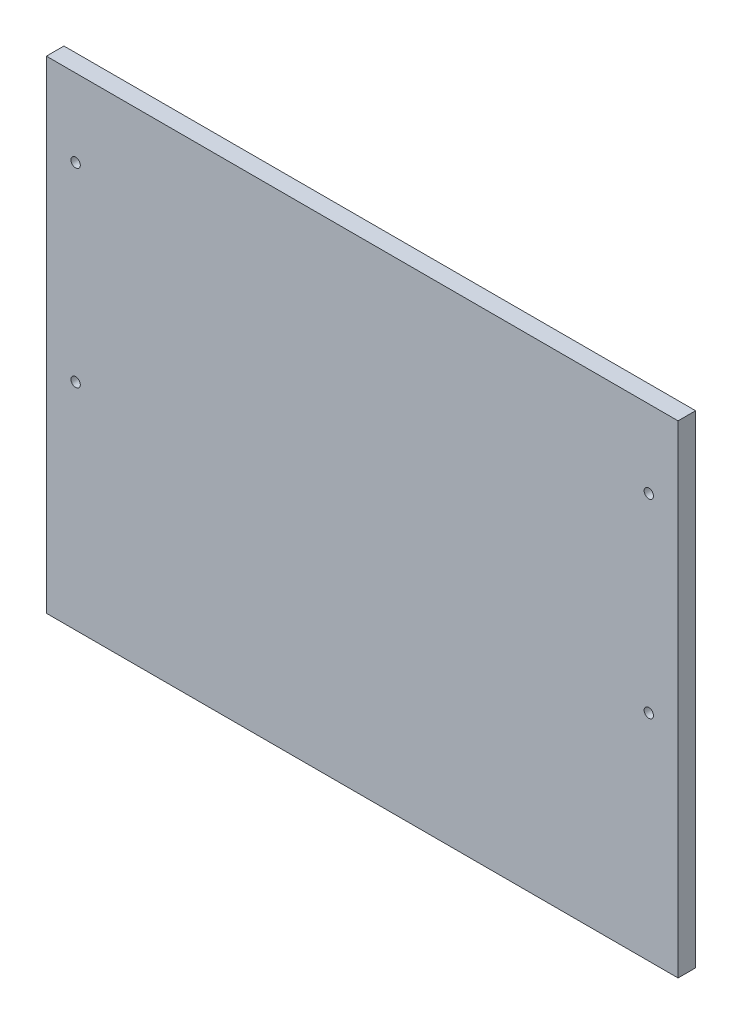
ISO-10303-21;
HEADER;
FILE_DESCRIPTION(('STEP AP214'),'2;1');
FILE_NAME('part.step','',(''),(''),'','','');
FILE_SCHEMA(('AUTOMOTIVE_DESIGN { 1 0 10303 214 1 1 1 1 }'));
ENDSEC;
DATA;
#1=APPLICATION_CONTEXT('core data for automotive mechanical design processes');
#2=APPLICATION_PROTOCOL_DEFINITION('international standard','automotive_design',2000,#1);
#3=PRODUCT_CONTEXT('',#1,'mechanical');
#4=PRODUCT('Part','Part','',(#3));
#5=PRODUCT_RELATED_PRODUCT_CATEGORY('part','',(#4));
#6=PRODUCT_DEFINITION_FORMATION('','',#4);
#7=PRODUCT_DEFINITION_CONTEXT('part definition',#1,'design');
#8=PRODUCT_DEFINITION('design','',#6,#7);
#9=PRODUCT_DEFINITION_SHAPE('','',#8);
#10=(LENGTH_UNIT() NAMED_UNIT(*) SI_UNIT(.MILLI.,.METRE.));
#11=(NAMED_UNIT(*) PLANE_ANGLE_UNIT() SI_UNIT($,.RADIAN.));
#12=(NAMED_UNIT(*) SI_UNIT($,.STERADIAN.) SOLID_ANGLE_UNIT());
#13=UNCERTAINTY_MEASURE_WITH_UNIT(LENGTH_MEASURE(1.E-05),#10,'distance_accuracy_value','');
#14=(GEOMETRIC_REPRESENTATION_CONTEXT(3) GLOBAL_UNCERTAINTY_ASSIGNED_CONTEXT((#13)) GLOBAL_UNIT_ASSIGNED_CONTEXT((#10,
#11,#12)) REPRESENTATION_CONTEXT('',''));
#15=CARTESIAN_POINT('',(0.,0.,0.));
#16=DIRECTION('',(0.,0.,1.));
#17=DIRECTION('',(1.,0.,0.));
#18=AXIS2_PLACEMENT_3D('',#15,#16,#17);
#19=CARTESIAN_POINT('',(0.,0.,12.));
#20=DIRECTION('',(0.,0.,1.));
#21=DIRECTION('',(1.,0.,0.));
#22=AXIS2_PLACEMENT_3D('',#19,#20,#21);
#23=PLANE('',#22);
#24=CARTESIAN_POINT('',(20.,-88.,12.));
#25=DIRECTION('',(0.,0.,1.));
#26=DIRECTION('',(1.,0.,0.));
#27=AXIS2_PLACEMENT_3D('',#24,#25,#26);
#28=CIRCLE('',#27,3.2);
#29=CARTESIAN_POINT('',(23.2,-88.,12.));
#30=VERTEX_POINT('',#29);
#31=EDGE_CURVE('E129',#30,#30,#28,.T.);
#32=ORIENTED_EDGE('',*,*,#31,.F.);
#33=EDGE_LOOP('',(#32));
#34=FACE_BOUND('',#33,.T.);
#35=CARTESIAN_POINT('',(20.,42.,12.));
#36=DIRECTION('',(0.,0.,1.));
#37=DIRECTION('',(1.,0.,0.));
#38=AXIS2_PLACEMENT_3D('',#35,#36,#37);
#39=CIRCLE('',#38,3.2);
#40=CARTESIAN_POINT('',(23.2,42.,12.));
#41=VERTEX_POINT('',#40);
#42=EDGE_CURVE('E108',#41,#41,#39,.T.);
#43=ORIENTED_EDGE('',*,*,#42,.F.);
#44=EDGE_LOOP('',(#43));
#45=FACE_BOUND('',#44,.T.);
#46=DIRECTION('',(0.,-1.,0.));
#47=VECTOR('',#46,1.);
#48=CARTESIAN_POINT('',(0.,95.,12.));
#49=LINE('',#48,#47);
#50=CARTESIAN_POINT('',(0.,95.,12.));
#51=VERTEX_POINT('',#50);
#52=CARTESIAN_POINT('',(0.,-235.,12.));
#53=VERTEX_POINT('',#52);
#54=EDGE_CURVE('E93',#51,#53,#49,.T.);
#55=ORIENTED_EDGE('',*,*,#54,.T.);
#56=DIRECTION('',(1.,0.,0.));
#57=VECTOR('',#56,1.);
#58=CARTESIAN_POINT('',(0.,-235.,12.));
#59=LINE('',#58,#57);
#60=CARTESIAN_POINT('',(432.,-235.,12.));
#61=VERTEX_POINT('',#60);
#62=EDGE_CURVE('E88',#53,#61,#59,.T.);
#63=ORIENTED_EDGE('',*,*,#62,.T.);
#64=DIRECTION('',(0.,1.,0.));
#65=VECTOR('',#64,1.);
#66=CARTESIAN_POINT('',(432.,-235.,12.));
#67=LINE('',#66,#65);
#68=CARTESIAN_POINT('',(432.,95.,12.));
#69=VERTEX_POINT('',#68);
#70=EDGE_CURVE('E91',#61,#69,#67,.T.);
#71=ORIENTED_EDGE('',*,*,#70,.T.);
#72=DIRECTION('',(-1.,0.,0.));
#73=VECTOR('',#72,1.);
#74=CARTESIAN_POINT('',(432.,95.,12.));
#75=LINE('',#74,#73);
#76=EDGE_CURVE('E58',#69,#51,#75,.T.);
#77=ORIENTED_EDGE('',*,*,#76,.T.);
#78=EDGE_LOOP('',(#55,#63,#71,#77));
#79=FACE_BOUND('',#78,.T.);
#80=CARTESIAN_POINT('',(412.,42.,12.));
#81=DIRECTION('',(0.,0.,1.));
#82=DIRECTION('',(1.,0.,0.));
#83=AXIS2_PLACEMENT_3D('',#80,#81,#82);
#84=CIRCLE('',#83,3.19999999999998);
#85=CARTESIAN_POINT('',(415.2,42.,12.));
#86=VERTEX_POINT('',#85);
#87=EDGE_CURVE('E123',#86,#86,#84,.T.);
#88=ORIENTED_EDGE('',*,*,#87,.F.);
#89=EDGE_LOOP('',(#88));
#90=FACE_BOUND('',#89,.T.);
#91=CARTESIAN_POINT('',(412.,-88.,12.));
#92=DIRECTION('',(0.,0.,1.));
#93=DIRECTION('',(1.,0.,0.));
#94=AXIS2_PLACEMENT_3D('',#91,#92,#93);
#95=CIRCLE('',#94,3.19999999999998);
#96=CARTESIAN_POINT('',(415.2,-88.,12.));
#97=VERTEX_POINT('',#96);
#98=EDGE_CURVE('E135',#97,#97,#95,.T.);
#99=ORIENTED_EDGE('',*,*,#98,.F.);
#100=EDGE_LOOP('',(#99));
#101=FACE_BOUND('',#100,.T.);
#102=ADVANCED_FACE('F41',(#34,#45,#79,#90,#101),#23,.T.);
#103=CARTESIAN_POINT('',(0.,0.,0.));
#104=DIRECTION('',(0.,0.,1.));
#105=DIRECTION('',(1.,0.,0.));
#106=AXIS2_PLACEMENT_3D('',#103,#104,#105);
#107=PLANE('',#106);
#108=DIRECTION('',(0.,-1.,0.));
#109=VECTOR('',#108,1.);
#110=CARTESIAN_POINT('',(0.,95.,0.));
#111=LINE('',#110,#109);
#112=CARTESIAN_POINT('',(0.,95.,0.));
#113=VERTEX_POINT('',#112);
#114=CARTESIAN_POINT('',(0.,-235.,0.));
#115=VERTEX_POINT('',#114);
#116=EDGE_CURVE('E105',#113,#115,#111,.T.);
#117=ORIENTED_EDGE('',*,*,#116,.F.);
#118=DIRECTION('',(-1.,0.,0.));
#119=VECTOR('',#118,1.);
#120=CARTESIAN_POINT('',(432.,95.,0.));
#121=LINE('',#120,#119);
#122=CARTESIAN_POINT('',(432.,95.,0.));
#123=VERTEX_POINT('',#122);
#124=EDGE_CURVE('E81',#123,#113,#121,.T.);
#125=ORIENTED_EDGE('',*,*,#124,.F.);
#126=DIRECTION('',(0.,1.,0.));
#127=VECTOR('',#126,1.);
#128=CARTESIAN_POINT('',(432.,-235.,0.));
#129=LINE('',#128,#127);
#130=CARTESIAN_POINT('',(432.,-235.,0.));
#131=VERTEX_POINT('',#130);
#132=EDGE_CURVE('E75',#131,#123,#129,.T.);
#133=ORIENTED_EDGE('',*,*,#132,.F.);
#134=DIRECTION('',(1.,0.,0.));
#135=VECTOR('',#134,1.);
#136=CARTESIAN_POINT('',(0.,-235.,0.));
#137=LINE('',#136,#135);
#138=EDGE_CURVE('E97',#115,#131,#137,.T.);
#139=ORIENTED_EDGE('',*,*,#138,.F.);
#140=EDGE_LOOP('',(#117,#125,#133,#139));
#141=FACE_BOUND('',#140,.T.);
#142=CARTESIAN_POINT('',(20.,42.,0.));
#143=DIRECTION('',(0.,0.,1.));
#144=DIRECTION('',(1.,0.,0.));
#145=AXIS2_PLACEMENT_3D('',#142,#143,#144);
#146=CIRCLE('',#145,3.2);
#147=CARTESIAN_POINT('',(23.2,42.,0.));
#148=VERTEX_POINT('',#147);
#149=EDGE_CURVE('E120',#148,#148,#146,.T.);
#150=ORIENTED_EDGE('',*,*,#149,.T.);
#151=EDGE_LOOP('',(#150));
#152=FACE_BOUND('',#151,.T.);
#153=CARTESIAN_POINT('',(412.,42.,0.));
#154=DIRECTION('',(0.,0.,1.));
#155=DIRECTION('',(1.,0.,0.));
#156=AXIS2_PLACEMENT_3D('',#153,#154,#155);
#157=CIRCLE('',#156,3.19999999999998);
#158=CARTESIAN_POINT('',(415.2,42.,0.));
#159=VERTEX_POINT('',#158);
#160=EDGE_CURVE('E126',#159,#159,#157,.T.);
#161=ORIENTED_EDGE('',*,*,#160,.T.);
#162=EDGE_LOOP('',(#161));
#163=FACE_BOUND('',#162,.T.);
#164=CARTESIAN_POINT('',(20.,-88.,0.));
#165=DIRECTION('',(0.,0.,1.));
#166=DIRECTION('',(1.,0.,0.));
#167=AXIS2_PLACEMENT_3D('',#164,#165,#166);
#168=CIRCLE('',#167,3.2);
#169=CARTESIAN_POINT('',(23.2,-88.,0.));
#170=VERTEX_POINT('',#169);
#171=EDGE_CURVE('E132',#170,#170,#168,.T.);
#172=ORIENTED_EDGE('',*,*,#171,.T.);
#173=EDGE_LOOP('',(#172));
#174=FACE_BOUND('',#173,.T.);
#175=CARTESIAN_POINT('',(412.,-88.,0.));
#176=DIRECTION('',(0.,0.,1.));
#177=DIRECTION('',(1.,0.,0.));
#178=AXIS2_PLACEMENT_3D('',#175,#176,#177);
#179=CIRCLE('',#178,3.19999999999998);
#180=CARTESIAN_POINT('',(415.2,-88.,0.));
#181=VERTEX_POINT('',#180);
#182=EDGE_CURVE('E138',#181,#181,#179,.T.);
#183=ORIENTED_EDGE('',*,*,#182,.T.);
#184=EDGE_LOOP('',(#183));
#185=FACE_BOUND('',#184,.T.);
#186=ADVANCED_FACE('F116',(#141,#152,#163,#174,#185),#107,.F.);
#187=CARTESIAN_POINT('',(0.,95.,12.));
#188=DIRECTION('',(1.,0.,0.));
#189=DIRECTION('',(0.,0.,-1.));
#190=AXIS2_PLACEMENT_3D('',#187,#188,#189);
#191=PLANE('',#190);
#192=ORIENTED_EDGE('',*,*,#116,.T.);
#193=DIRECTION('',(0.,0.,-1.));
#194=VECTOR('',#193,1.);
#195=CARTESIAN_POINT('',(0.,-235.,12.));
#196=LINE('',#195,#194);
#197=EDGE_CURVE('E11',#53,#115,#196,.T.);
#198=ORIENTED_EDGE('',*,*,#197,.F.);
#199=ORIENTED_EDGE('',*,*,#54,.F.);
#200=DIRECTION('',(0.,0.,-1.));
#201=VECTOR('',#200,1.);
#202=CARTESIAN_POINT('',(0.,95.,12.));
#203=LINE('',#202,#201);
#204=EDGE_CURVE('E101',#51,#113,#203,.T.);
#205=ORIENTED_EDGE('',*,*,#204,.T.);
#206=EDGE_LOOP('',(#192,#198,#199,#205));
#207=FACE_BOUND('',#206,.T.);
#208=ADVANCED_FACE('F43',(#207),#191,.F.);
#209=CARTESIAN_POINT('',(0.,-235.,12.));
#210=DIRECTION('',(0.,1.,0.));
#211=DIRECTION('',(0.,0.,1.));
#212=AXIS2_PLACEMENT_3D('',#209,#210,#211);
#213=PLANE('',#212);
#214=ORIENTED_EDGE('',*,*,#138,.T.);
#215=DIRECTION('',(0.,0.,-1.));
#216=VECTOR('',#215,1.);
#217=CARTESIAN_POINT('',(432.,-235.,12.));
#218=LINE('',#217,#216);
#219=EDGE_CURVE('E50',#61,#131,#218,.T.);
#220=ORIENTED_EDGE('',*,*,#219,.F.);
#221=ORIENTED_EDGE('',*,*,#62,.F.);
#222=ORIENTED_EDGE('',*,*,#197,.T.);
#223=EDGE_LOOP('',(#214,#220,#221,#222));
#224=FACE_BOUND('',#223,.T.);
#225=ADVANCED_FACE('F96',(#224),#213,.F.);
#226=CARTESIAN_POINT('',(432.,-235.,12.));
#227=DIRECTION('',(-1.,0.,0.));
#228=DIRECTION('',(0.,0.,1.));
#229=AXIS2_PLACEMENT_3D('',#226,#227,#228);
#230=PLANE('',#229);
#231=ORIENTED_EDGE('',*,*,#132,.T.);
#232=DIRECTION('',(0.,0.,-1.));
#233=VECTOR('',#232,1.);
#234=CARTESIAN_POINT('',(432.,95.,12.));
#235=LINE('',#234,#233);
#236=EDGE_CURVE('E98',#69,#123,#235,.T.);
#237=ORIENTED_EDGE('',*,*,#236,.F.);
#238=ORIENTED_EDGE('',*,*,#70,.F.);
#239=ORIENTED_EDGE('',*,*,#219,.T.);
#240=EDGE_LOOP('',(#231,#237,#238,#239));
#241=FACE_BOUND('',#240,.T.);
#242=ADVANCED_FACE('F99',(#241),#230,.F.);
#243=CARTESIAN_POINT('',(432.,95.,12.));
#244=DIRECTION('',(0.,-1.,0.));
#245=DIRECTION('',(0.,0.,-1.));
#246=AXIS2_PLACEMENT_3D('',#243,#244,#245);
#247=PLANE('',#246);
#248=ORIENTED_EDGE('',*,*,#124,.T.);
#249=ORIENTED_EDGE('',*,*,#204,.F.);
#250=ORIENTED_EDGE('',*,*,#76,.F.);
#251=ORIENTED_EDGE('',*,*,#236,.T.);
#252=EDGE_LOOP('',(#248,#249,#250,#251));
#253=FACE_BOUND('',#252,.T.);
#254=ADVANCED_FACE('F113',(#253),#247,.F.);
#255=CARTESIAN_POINT('',(20.,42.,12.));
#256=DIRECTION('',(0.,0.,-1.));
#257=DIRECTION('',(-1.,0.,0.));
#258=AXIS2_PLACEMENT_3D('',#255,#256,#257);
#259=CYLINDRICAL_SURFACE('',#258,3.2);
#260=ORIENTED_EDGE('',*,*,#42,.T.);
#261=EDGE_LOOP('',(#260));
#262=FACE_BOUND('',#261,.T.);
#263=ORIENTED_EDGE('',*,*,#149,.F.);
#264=EDGE_LOOP('',(#263));
#265=FACE_BOUND('',#264,.T.);
#266=ADVANCED_FACE('F157',(#262,#265),#259,.F.);
#267=CARTESIAN_POINT('',(412.,42.,12.));
#268=DIRECTION('',(0.,0.,-1.));
#269=DIRECTION('',(-1.,0.,0.));
#270=AXIS2_PLACEMENT_3D('',#267,#268,#269);
#271=CYLINDRICAL_SURFACE('',#270,3.19999999999998);
#272=ORIENTED_EDGE('',*,*,#87,.T.);
#273=EDGE_LOOP('',(#272));
#274=FACE_BOUND('',#273,.T.);
#275=ORIENTED_EDGE('',*,*,#160,.F.);
#276=EDGE_LOOP('',(#275));
#277=FACE_BOUND('',#276,.T.);
#278=ADVANCED_FACE('F202',(#274,#277),#271,.F.);
#279=CARTESIAN_POINT('',(20.,-88.,12.));
#280=DIRECTION('',(0.,0.,-1.));
#281=DIRECTION('',(-1.,0.,0.));
#282=AXIS2_PLACEMENT_3D('',#279,#280,#281);
#283=CYLINDRICAL_SURFACE('',#282,3.2);
#284=ORIENTED_EDGE('',*,*,#31,.T.);
#285=EDGE_LOOP('',(#284));
#286=FACE_BOUND('',#285,.T.);
#287=ORIENTED_EDGE('',*,*,#171,.F.);
#288=EDGE_LOOP('',(#287));
#289=FACE_BOUND('',#288,.T.);
#290=ADVANCED_FACE('F210',(#286,#289),#283,.F.);
#291=CARTESIAN_POINT('',(412.,-88.,12.));
#292=DIRECTION('',(0.,0.,-1.));
#293=DIRECTION('',(-1.,0.,0.));
#294=AXIS2_PLACEMENT_3D('',#291,#292,#293);
#295=CYLINDRICAL_SURFACE('',#294,3.19999999999998);
#296=ORIENTED_EDGE('',*,*,#98,.T.);
#297=EDGE_LOOP('',(#296));
#298=FACE_BOUND('',#297,.T.);
#299=ORIENTED_EDGE('',*,*,#182,.F.);
#300=EDGE_LOOP('',(#299));
#301=FACE_BOUND('',#300,.T.);
#302=ADVANCED_FACE('F144',(#298,#301),#295,.F.);
#303=CLOSED_SHELL('',(#102,#186,#208,#225,#242,#254,#266,#278,#290,#302));
#304=MANIFOLD_SOLID_BREP('B2',#303);
#305=ADVANCED_BREP_SHAPE_REPRESENTATION('',(#18,#304),#14);
#306=SHAPE_DEFINITION_REPRESENTATION(#9,#305);
ENDSEC;
END-ISO-10303-21;
